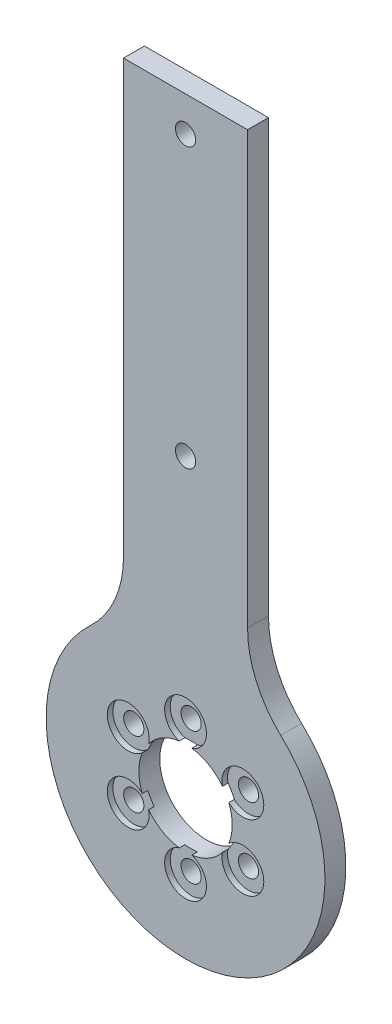
ISO-10303-21;
HEADER;
FILE_DESCRIPTION(('STEP AP214'),'2;1');
FILE_NAME('part.step','',(''),(''),'','','');
FILE_SCHEMA(('AUTOMOTIVE_DESIGN { 1 0 10303 214 1 1 1 1 }'));
ENDSEC;
DATA;
#1=APPLICATION_CONTEXT('core data for automotive mechanical design processes');
#2=APPLICATION_PROTOCOL_DEFINITION('international standard','automotive_design',2000,#1);
#3=PRODUCT_CONTEXT('',#1,'mechanical');
#4=PRODUCT('Part','Part','',(#3));
#5=PRODUCT_RELATED_PRODUCT_CATEGORY('part','',(#4));
#6=PRODUCT_DEFINITION_FORMATION('','',#4);
#7=PRODUCT_DEFINITION_CONTEXT('part definition',#1,'design');
#8=PRODUCT_DEFINITION('design','',#6,#7);
#9=PRODUCT_DEFINITION_SHAPE('','',#8);
#10=(LENGTH_UNIT() NAMED_UNIT(*) SI_UNIT(.MILLI.,.METRE.));
#11=(NAMED_UNIT(*) PLANE_ANGLE_UNIT() SI_UNIT($,.RADIAN.));
#12=(NAMED_UNIT(*) SI_UNIT($,.STERADIAN.) SOLID_ANGLE_UNIT());
#13=UNCERTAINTY_MEASURE_WITH_UNIT(LENGTH_MEASURE(1.E-05),#10,'distance_accuracy_value','');
#14=(GEOMETRIC_REPRESENTATION_CONTEXT(3) GLOBAL_UNCERTAINTY_ASSIGNED_CONTEXT((#13)) GLOBAL_UNIT_ASSIGNED_CONTEXT((#10,
#11,#12)) REPRESENTATION_CONTEXT('',''));
#15=CARTESIAN_POINT('',(0.,0.,0.));
#16=DIRECTION('',(0.,0.,1.));
#17=DIRECTION('',(1.,0.,0.));
#18=AXIS2_PLACEMENT_3D('',#15,#16,#17);
#19=CARTESIAN_POINT('',(0.,9.5,3.));
#20=DIRECTION('',(0.,0.,-1.));
#21=DIRECTION('',(-1.,0.,0.));
#22=AXIS2_PLACEMENT_3D('',#19,#20,#21);
#23=CYLINDRICAL_SURFACE('',#22,1.45);
#24=CARTESIAN_POINT('',(0.,9.5,0.));
#25=DIRECTION('',(0.,0.,1.));
#26=DIRECTION('',(1.,0.,0.));
#27=AXIS2_PLACEMENT_3D('',#24,#25,#26);
#28=CIRCLE('',#27,1.45);
#29=CARTESIAN_POINT('',(1.45,9.5,0.));
#30=VERTEX_POINT('',#29);
#31=EDGE_CURVE('E217',#30,#30,#28,.T.);
#32=ORIENTED_EDGE('',*,*,#31,.F.);
#33=EDGE_LOOP('',(#32));
#34=FACE_BOUND('',#33,.T.);
#35=CARTESIAN_POINT('',(0.,9.5,2.2));
#36=DIRECTION('',(0.,0.,1.));
#37=DIRECTION('',(1.,0.,0.));
#38=AXIS2_PLACEMENT_3D('',#35,#36,#37);
#39=CIRCLE('',#38,1.45);
#40=CARTESIAN_POINT('',(1.45,9.5,2.2));
#41=VERTEX_POINT('',#40);
#42=EDGE_CURVE('E282',#41,#41,#39,.T.);
#43=ORIENTED_EDGE('',*,*,#42,.T.);
#44=EDGE_LOOP('',(#43));
#45=FACE_BOUND('',#44,.T.);
#46=ADVANCED_FACE('F44',(#34,#45),#23,.F.);
#47=CARTESIAN_POINT('',(8.22724133595217,4.75,3.));
#48=DIRECTION('',(0.,0.,-1.));
#49=DIRECTION('',(-1.,0.,0.));
#50=AXIS2_PLACEMENT_3D('',#47,#48,#49);
#51=CYLINDRICAL_SURFACE('',#50,1.45);
#52=CARTESIAN_POINT('',(8.22724133595217,4.75,0.));
#53=DIRECTION('',(0.,0.,1.));
#54=DIRECTION('',(1.,0.,0.));
#55=AXIS2_PLACEMENT_3D('',#52,#53,#54);
#56=CIRCLE('',#55,1.45);
#57=CARTESIAN_POINT('',(9.67724133595217,4.75,0.));
#58=VERTEX_POINT('',#57);
#59=EDGE_CURVE('E388',#58,#58,#56,.T.);
#60=ORIENTED_EDGE('',*,*,#59,.F.);
#61=EDGE_LOOP('',(#60));
#62=FACE_BOUND('',#61,.T.);
#63=CARTESIAN_POINT('',(8.22724133595217,4.75,2.2));
#64=DIRECTION('',(0.,0.,1.));
#65=DIRECTION('',(1.,0.,0.));
#66=AXIS2_PLACEMENT_3D('',#63,#64,#65);
#67=CIRCLE('',#66,1.45);
#68=CARTESIAN_POINT('',(9.67724133595217,4.75,2.2));
#69=VERTEX_POINT('',#68);
#70=EDGE_CURVE('E277',#69,#69,#67,.T.);
#71=ORIENTED_EDGE('',*,*,#70,.T.);
#72=EDGE_LOOP('',(#71));
#73=FACE_BOUND('',#72,.T.);
#74=ADVANCED_FACE('F402',(#62,#73),#51,.F.);
#75=CARTESIAN_POINT('',(8.22724133595217,-4.75,3.));
#76=DIRECTION('',(0.,0.,-1.));
#77=DIRECTION('',(-1.,0.,0.));
#78=AXIS2_PLACEMENT_3D('',#75,#76,#77);
#79=CYLINDRICAL_SURFACE('',#78,1.45);
#80=CARTESIAN_POINT('',(8.22724133595217,-4.75,0.));
#81=DIRECTION('',(0.,0.,1.));
#82=DIRECTION('',(1.,0.,0.));
#83=AXIS2_PLACEMENT_3D('',#80,#81,#82);
#84=CIRCLE('',#83,1.45);
#85=CARTESIAN_POINT('',(9.67724133595217,-4.75,0.));
#86=VERTEX_POINT('',#85);
#87=EDGE_CURVE('E385',#86,#86,#84,.T.);
#88=ORIENTED_EDGE('',*,*,#87,.F.);
#89=EDGE_LOOP('',(#88));
#90=FACE_BOUND('',#89,.T.);
#91=CARTESIAN_POINT('',(8.22724133595217,-4.75,2.2));
#92=DIRECTION('',(0.,0.,1.));
#93=DIRECTION('',(1.,0.,0.));
#94=AXIS2_PLACEMENT_3D('',#91,#92,#93);
#95=CIRCLE('',#94,1.45);
#96=CARTESIAN_POINT('',(9.67724133595217,-4.75,2.2));
#97=VERTEX_POINT('',#96);
#98=EDGE_CURVE('E272',#97,#97,#95,.T.);
#99=ORIENTED_EDGE('',*,*,#98,.T.);
#100=EDGE_LOOP('',(#99));
#101=FACE_BOUND('',#100,.T.);
#102=ADVANCED_FACE('F541',(#90,#101),#79,.F.);
#103=CARTESIAN_POINT('',(0.,-9.5,3.));
#104=DIRECTION('',(0.,0.,-1.));
#105=DIRECTION('',(-1.,0.,0.));
#106=AXIS2_PLACEMENT_3D('',#103,#104,#105);
#107=CYLINDRICAL_SURFACE('',#106,1.45);
#108=CARTESIAN_POINT('',(0.,-9.5,0.));
#109=DIRECTION('',(0.,0.,1.));
#110=DIRECTION('',(1.,0.,0.));
#111=AXIS2_PLACEMENT_3D('',#108,#109,#110);
#112=CIRCLE('',#111,1.45);
#113=CARTESIAN_POINT('',(1.45,-9.5,0.));
#114=VERTEX_POINT('',#113);
#115=EDGE_CURVE('E381',#114,#114,#112,.T.);
#116=ORIENTED_EDGE('',*,*,#115,.F.);
#117=EDGE_LOOP('',(#116));
#118=FACE_BOUND('',#117,.T.);
#119=CARTESIAN_POINT('',(0.,-9.5,2.2));
#120=DIRECTION('',(0.,0.,1.));
#121=DIRECTION('',(1.,0.,0.));
#122=AXIS2_PLACEMENT_3D('',#119,#120,#121);
#123=CIRCLE('',#122,1.45);
#124=CARTESIAN_POINT('',(1.45,-9.5,2.2));
#125=VERTEX_POINT('',#124);
#126=EDGE_CURVE('E267',#125,#125,#123,.T.);
#127=ORIENTED_EDGE('',*,*,#126,.T.);
#128=EDGE_LOOP('',(#127));
#129=FACE_BOUND('',#128,.T.);
#130=ADVANCED_FACE('F537',(#118,#129),#107,.F.);
#131=CARTESIAN_POINT('',(-8.22724133595217,-4.75,3.));
#132=DIRECTION('',(0.,0.,-1.));
#133=DIRECTION('',(-1.,0.,0.));
#134=AXIS2_PLACEMENT_3D('',#131,#132,#133);
#135=CYLINDRICAL_SURFACE('',#134,1.45);
#136=CARTESIAN_POINT('',(-8.22724133595217,-4.75,0.));
#137=DIRECTION('',(0.,0.,1.));
#138=DIRECTION('',(1.,0.,0.));
#139=AXIS2_PLACEMENT_3D('',#136,#137,#138);
#140=CIRCLE('',#139,1.45);
#141=CARTESIAN_POINT('',(-6.77724133595216,-4.75,0.));
#142=VERTEX_POINT('',#141);
#143=EDGE_CURVE('E377',#142,#142,#140,.T.);
#144=ORIENTED_EDGE('',*,*,#143,.F.);
#145=EDGE_LOOP('',(#144));
#146=FACE_BOUND('',#145,.T.);
#147=CARTESIAN_POINT('',(-8.22724133595217,-4.75,2.2));
#148=DIRECTION('',(0.,0.,1.));
#149=DIRECTION('',(1.,0.,0.));
#150=AXIS2_PLACEMENT_3D('',#147,#148,#149);
#151=CIRCLE('',#150,1.45);
#152=CARTESIAN_POINT('',(-6.77724133595216,-4.75,2.2));
#153=VERTEX_POINT('',#152);
#154=EDGE_CURVE('E262',#153,#153,#151,.T.);
#155=ORIENTED_EDGE('',*,*,#154,.T.);
#156=EDGE_LOOP('',(#155));
#157=FACE_BOUND('',#156,.T.);
#158=ADVANCED_FACE('F533',(#146,#157),#135,.F.);
#159=CARTESIAN_POINT('',(-8.22724133595217,4.75,3.));
#160=DIRECTION('',(0.,0.,-1.));
#161=DIRECTION('',(-1.,0.,0.));
#162=AXIS2_PLACEMENT_3D('',#159,#160,#161);
#163=CYLINDRICAL_SURFACE('',#162,1.45);
#164=CARTESIAN_POINT('',(-8.22724133595217,4.75,0.));
#165=DIRECTION('',(0.,0.,1.));
#166=DIRECTION('',(1.,0.,0.));
#167=AXIS2_PLACEMENT_3D('',#164,#165,#166);
#168=CIRCLE('',#167,1.45);
#169=CARTESIAN_POINT('',(-6.77724133595217,4.75,0.));
#170=VERTEX_POINT('',#169);
#171=EDGE_CURVE('E373',#170,#170,#168,.T.);
#172=ORIENTED_EDGE('',*,*,#171,.F.);
#173=EDGE_LOOP('',(#172));
#174=FACE_BOUND('',#173,.T.);
#175=CARTESIAN_POINT('',(-8.22724133595217,4.75,2.2));
#176=DIRECTION('',(0.,0.,1.));
#177=DIRECTION('',(1.,0.,0.));
#178=AXIS2_PLACEMENT_3D('',#175,#176,#177);
#179=CIRCLE('',#178,1.45);
#180=CARTESIAN_POINT('',(-6.77724133595217,4.75,2.2));
#181=VERTEX_POINT('',#180);
#182=EDGE_CURVE('E257',#181,#181,#179,.T.);
#183=ORIENTED_EDGE('',*,*,#182,.T.);
#184=EDGE_LOOP('',(#183));
#185=FACE_BOUND('',#184,.T.);
#186=ADVANCED_FACE('F529',(#174,#185),#163,.F.);
#187=CARTESIAN_POINT('',(0.,0.,3.));
#188=DIRECTION('',(0.,0.,-1.));
#189=DIRECTION('',(-1.,0.,0.));
#190=AXIS2_PLACEMENT_3D('',#187,#188,#189);
#191=CYLINDRICAL_SURFACE('',#190,20.);
#192=CARTESIAN_POINT('',(0.,0.,3.));
#193=DIRECTION('',(0.,0.,1.));
#194=DIRECTION('',(1.,0.,0.));
#195=AXIS2_PLACEMENT_3D('',#192,#193,#194);
#196=CIRCLE('',#195,20.);
#197=CARTESIAN_POINT('',(-13.6571428571429,14.6110386003046,3.));
#198=VERTEX_POINT('',#197);
#199=CARTESIAN_POINT('',(13.6571428571429,14.6110386003046,3.));
#200=VERTEX_POINT('',#199);
#201=EDGE_CURVE('E222',#198,#200,#196,.T.);
#202=ORIENTED_EDGE('',*,*,#201,.F.);
#203=DIRECTION('',(0.,0.,-1.));
#204=VECTOR('',#203,1.);
#205=CARTESIAN_POINT('',(-13.6571428571429,14.6110386003046,3.));
#206=LINE('',#205,#204);
#207=CARTESIAN_POINT('',(-13.6571428571429,14.6110386003046,0.));
#208=VERTEX_POINT('',#207);
#209=EDGE_CURVE('E237',#198,#208,#206,.T.);
#210=ORIENTED_EDGE('',*,*,#209,.T.);
#211=CARTESIAN_POINT('',(0.,0.,0.));
#212=DIRECTION('',(0.,0.,1.));
#213=DIRECTION('',(1.,0.,0.));
#214=AXIS2_PLACEMENT_3D('',#211,#212,#213);
#215=CIRCLE('',#214,20.);
#216=CARTESIAN_POINT('',(13.6571428571429,14.6110386003046,0.));
#217=VERTEX_POINT('',#216);
#218=EDGE_CURVE('E227',#208,#217,#215,.T.);
#219=ORIENTED_EDGE('',*,*,#218,.T.);
#220=DIRECTION('',(0.,0.,-1.));
#221=VECTOR('',#220,1.);
#222=CARTESIAN_POINT('',(13.6571428571429,14.6110386003046,3.));
#223=LINE('',#222,#221);
#224=EDGE_CURVE('E234',#217,#200,#223,.F.);
#225=ORIENTED_EDGE('',*,*,#224,.T.);
#226=EDGE_LOOP('',(#202,#210,#219,#225));
#227=FACE_BOUND('',#226,.T.);
#228=ADVANCED_FACE('F532',(#227),#191,.T.);
#229=CARTESIAN_POINT('',(0.,0.,3.));
#230=DIRECTION('',(0.,0.,1.));
#231=DIRECTION('',(1.,0.,0.));
#232=AXIS2_PLACEMENT_3D('',#229,#230,#231);
#233=PLANE('',#232);
#234=CARTESIAN_POINT('',(8.22724133595217,4.75,3.));
#235=DIRECTION('',(0.,0.,1.));
#236=DIRECTION('',(1.,0.,0.));
#237=AXIS2_PLACEMENT_3D('',#234,#235,#236);
#238=CIRCLE('',#237,3.);
#239=CARTESIAN_POINT('',(6.20071150321712,2.53794737019327,3.));
#240=VERTEX_POINT('',#239);
#241=CARTESIAN_POINT('',(5.29828264766384,4.10099999822778,3.));
#242=VERTEX_POINT('',#241);
#243=EDGE_CURVE('E318',#240,#242,#238,.T.);
#244=ORIENTED_EDGE('',*,*,#243,.F.);
#245=CARTESIAN_POINT('',(0.,0.,3.));
#246=DIRECTION('',(0.,0.,1.));
#247=DIRECTION('',(1.,0.,0.));
#248=AXIS2_PLACEMENT_3D('',#245,#246,#247);
#249=CIRCLE('',#248,6.7);
#250=CARTESIAN_POINT('',(6.20071150321712,-2.53794737019327,3.));
#251=VERTEX_POINT('',#250);
#252=EDGE_CURVE('E211',#251,#240,#249,.T.);
#253=ORIENTED_EDGE('',*,*,#252,.F.);
#254=CARTESIAN_POINT('',(8.22724133595217,-4.75,3.));
#255=DIRECTION('',(0.,0.,1.));
#256=DIRECTION('',(1.,0.,0.));
#257=AXIS2_PLACEMENT_3D('',#254,#255,#256);
#258=CIRCLE('',#257,3.);
#259=CARTESIAN_POINT('',(5.29828264766384,-4.10099999822778,3.));
#260=VERTEX_POINT('',#259);
#261=EDGE_CURVE('E459',#260,#251,#258,.T.);
#262=ORIENTED_EDGE('',*,*,#261,.F.);
#263=CARTESIAN_POINT('',(0.90242885555327,-6.63894736842105,3.));
#264=VERTEX_POINT('',#263);
#265=EDGE_CURVE('E210',#264,#260,#249,.T.);
#266=ORIENTED_EDGE('',*,*,#265,.F.);
#267=CARTESIAN_POINT('',(0.,-9.5,3.));
#268=DIRECTION('',(0.,0.,1.));
#269=DIRECTION('',(1.,0.,0.));
#270=AXIS2_PLACEMENT_3D('',#267,#268,#269);
#271=CIRCLE('',#270,3.);
#272=CARTESIAN_POINT('',(-0.902428855553268,-6.63894736842105,3.));
#273=VERTEX_POINT('',#272);
#274=EDGE_CURVE('E443',#273,#264,#271,.T.);
#275=ORIENTED_EDGE('',*,*,#274,.F.);
#276=CARTESIAN_POINT('',(-5.29828264766384,-4.10099999822778,3.));
#277=VERTEX_POINT('',#276);
#278=EDGE_CURVE('E204',#277,#273,#249,.T.);
#279=ORIENTED_EDGE('',*,*,#278,.F.);
#280=CARTESIAN_POINT('',(-8.22724133595217,-4.75,3.));
#281=DIRECTION('',(0.,0.,1.));
#282=DIRECTION('',(1.,0.,0.));
#283=AXIS2_PLACEMENT_3D('',#280,#281,#282);
#284=CIRCLE('',#283,3.);
#285=CARTESIAN_POINT('',(-6.20071150321711,-2.53794737019328,3.));
#286=VERTEX_POINT('',#285);
#287=EDGE_CURVE('E201',#286,#277,#284,.T.);
#288=ORIENTED_EDGE('',*,*,#287,.F.);
#289=CARTESIAN_POINT('',(-6.20071150321711,2.53794737019328,3.));
#290=VERTEX_POINT('',#289);
#291=EDGE_CURVE('E191',#290,#286,#249,.T.);
#292=ORIENTED_EDGE('',*,*,#291,.F.);
#293=CARTESIAN_POINT('',(-8.22724133595217,4.75,3.));
#294=DIRECTION('',(0.,0.,1.));
#295=DIRECTION('',(1.,0.,0.));
#296=AXIS2_PLACEMENT_3D('',#293,#294,#295);
#297=CIRCLE('',#296,3.);
#298=CARTESIAN_POINT('',(-5.29828264766384,4.10099999822778,3.));
#299=VERTEX_POINT('',#298);
#300=EDGE_CURVE('E169',#299,#290,#297,.T.);
#301=ORIENTED_EDGE('',*,*,#300,.F.);
#302=CARTESIAN_POINT('',(-0.902428855553269,6.63894736842105,3.));
#303=VERTEX_POINT('',#302);
#304=EDGE_CURVE('E203',#303,#299,#249,.T.);
#305=ORIENTED_EDGE('',*,*,#304,.F.);
#306=CARTESIAN_POINT('',(0.,9.5,3.));
#307=DIRECTION('',(0.,0.,1.));
#308=DIRECTION('',(1.,0.,0.));
#309=AXIS2_PLACEMENT_3D('',#306,#307,#308);
#310=CIRCLE('',#309,3.);
#311=CARTESIAN_POINT('',(0.902428855553269,6.63894736842105,3.));
#312=VERTEX_POINT('',#311);
#313=EDGE_CURVE('E415',#312,#303,#310,.T.);
#314=ORIENTED_EDGE('',*,*,#313,.F.);
#315=EDGE_CURVE('E208',#242,#312,#249,.T.);
#316=ORIENTED_EDGE('',*,*,#315,.F.);
#317=EDGE_LOOP('',(#244,#253,#262,#266,#275,#279,#288,#292,#301,#305,#314,#316));
#318=FACE_BOUND('',#317,.T.);
#319=DIRECTION('',(0.,-1.,0.));
#320=VECTOR('',#319,1.);
#321=CARTESIAN_POINT('',(-8.9,12.5,3.));
#322=LINE('',#321,#320);
#323=CARTESIAN_POINT('',(-8.9,87.5,3.));
#324=VERTEX_POINT('',#323);
#325=CARTESIAN_POINT('',(-8.9,25.5693175505331,3.));
#326=VERTEX_POINT('',#325);
#327=EDGE_CURVE('E353',#324,#326,#322,.T.);
#328=ORIENTED_EDGE('',*,*,#327,.T.);
#329=CARTESIAN_POINT('',(-23.9,25.5693175505331,3.));
#330=DIRECTION('',(0.,0.,1.));
#331=DIRECTION('',(1.,0.,0.));
#332=AXIS2_PLACEMENT_3D('',#329,#330,#331);
#333=CIRCLE('',#332,15.);
#334=EDGE_CURVE('E244',#326,#198,#333,.F.);
#335=ORIENTED_EDGE('',*,*,#334,.T.);
#336=ORIENTED_EDGE('',*,*,#201,.T.);
#337=CARTESIAN_POINT('',(23.9,25.5693175505331,3.));
#338=DIRECTION('',(0.,0.,1.));
#339=DIRECTION('',(1.,0.,0.));
#340=AXIS2_PLACEMENT_3D('',#337,#338,#339);
#341=CIRCLE('',#340,15.);
#342=CARTESIAN_POINT('',(8.9,25.5693175505331,3.));
#343=VERTEX_POINT('',#342);
#344=EDGE_CURVE('E253',#200,#343,#341,.F.);
#345=ORIENTED_EDGE('',*,*,#344,.T.);
#346=DIRECTION('',(0.,1.,0.));
#347=VECTOR('',#346,1.);
#348=CARTESIAN_POINT('',(8.9,12.5,3.));
#349=LINE('',#348,#347);
#350=CARTESIAN_POINT('',(8.9,87.5,3.));
#351=VERTEX_POINT('',#350);
#352=EDGE_CURVE('E346',#343,#351,#349,.T.);
#353=ORIENTED_EDGE('',*,*,#352,.T.);
#354=DIRECTION('',(-1.,0.,0.));
#355=VECTOR('',#354,1.);
#356=CARTESIAN_POINT('',(-8.9,87.5,3.));
#357=LINE('',#356,#355);
#358=EDGE_CURVE('E349',#351,#324,#357,.T.);
#359=ORIENTED_EDGE('',*,*,#358,.T.);
#360=EDGE_LOOP('',(#328,#335,#336,#345,#353,#359));
#361=FACE_BOUND('',#360,.T.);
#362=CARTESIAN_POINT('',(0.,42.5,3.));
#363=DIRECTION('',(0.,0.,1.));
#364=DIRECTION('',(1.,0.,0.));
#365=AXIS2_PLACEMENT_3D('',#362,#363,#364);
#366=CIRCLE('',#365,1.45);
#367=CARTESIAN_POINT('',(1.45,42.5,3.));
#368=VERTEX_POINT('',#367);
#369=EDGE_CURVE('E338',#368,#368,#366,.T.);
#370=ORIENTED_EDGE('',*,*,#369,.F.);
#371=EDGE_LOOP('',(#370));
#372=FACE_BOUND('',#371,.T.);
#373=CARTESIAN_POINT('',(0.,82.5,3.));
#374=DIRECTION('',(0.,0.,1.));
#375=DIRECTION('',(1.,0.,0.));
#376=AXIS2_PLACEMENT_3D('',#373,#374,#375);
#377=CIRCLE('',#376,1.45);
#378=CARTESIAN_POINT('',(1.45,82.5,3.));
#379=VERTEX_POINT('',#378);
#380=EDGE_CURVE('E330',#379,#379,#377,.T.);
#381=ORIENTED_EDGE('',*,*,#380,.F.);
#382=EDGE_LOOP('',(#381));
#383=FACE_BOUND('',#382,.T.);
#384=ADVANCED_FACE('F198',(#318,#361,#372,#383),#233,.T.);
#385=CARTESIAN_POINT('',(0.,0.,0.));
#386=DIRECTION('',(0.,0.,1.));
#387=DIRECTION('',(1.,0.,0.));
#388=AXIS2_PLACEMENT_3D('',#385,#386,#387);
#389=PLANE('',#388);
#390=ORIENTED_EDGE('',*,*,#218,.F.);
#391=CARTESIAN_POINT('',(-23.9,25.5693175505331,0.));
#392=DIRECTION('',(0.,0.,1.));
#393=DIRECTION('',(1.,0.,0.));
#394=AXIS2_PLACEMENT_3D('',#391,#392,#393);
#395=CIRCLE('',#394,15.);
#396=CARTESIAN_POINT('',(-8.9,25.5693175505331,0.));
#397=VERTEX_POINT('',#396);
#398=EDGE_CURVE('E247',#208,#397,#395,.T.);
#399=ORIENTED_EDGE('',*,*,#398,.T.);
#400=DIRECTION('',(0.,-1.,0.));
#401=VECTOR('',#400,1.);
#402=CARTESIAN_POINT('',(-8.9,12.5,0.));
#403=LINE('',#402,#401);
#404=CARTESIAN_POINT('',(-8.9,87.5,0.));
#405=VERTEX_POINT('',#404);
#406=EDGE_CURVE('E350',#405,#397,#403,.T.);
#407=ORIENTED_EDGE('',*,*,#406,.F.);
#408=DIRECTION('',(-1.,0.,0.));
#409=VECTOR('',#408,1.);
#410=CARTESIAN_POINT('',(-8.9,87.5,0.));
#411=LINE('',#410,#409);
#412=CARTESIAN_POINT('',(8.9,87.5,0.));
#413=VERTEX_POINT('',#412);
#414=EDGE_CURVE('E360',#413,#405,#411,.T.);
#415=ORIENTED_EDGE('',*,*,#414,.F.);
#416=DIRECTION('',(0.,1.,0.));
#417=VECTOR('',#416,1.);
#418=CARTESIAN_POINT('',(8.9,12.5,0.));
#419=LINE('',#418,#417);
#420=CARTESIAN_POINT('',(8.9,25.5693175505331,0.));
#421=VERTEX_POINT('',#420);
#422=EDGE_CURVE('E342',#421,#413,#419,.T.);
#423=ORIENTED_EDGE('',*,*,#422,.F.);
#424=CARTESIAN_POINT('',(23.9,25.5693175505331,0.));
#425=DIRECTION('',(0.,0.,1.));
#426=DIRECTION('',(1.,0.,0.));
#427=AXIS2_PLACEMENT_3D('',#424,#425,#426);
#428=CIRCLE('',#427,15.);
#429=EDGE_CURVE('E250',#421,#217,#428,.T.);
#430=ORIENTED_EDGE('',*,*,#429,.T.);
#431=EDGE_LOOP('',(#390,#399,#407,#415,#423,#430));
#432=FACE_BOUND('',#431,.T.);
#433=CARTESIAN_POINT('',(0.,42.5,0.));
#434=DIRECTION('',(0.,0.,1.));
#435=DIRECTION('',(1.,0.,0.));
#436=AXIS2_PLACEMENT_3D('',#433,#434,#435);
#437=CIRCLE('',#436,1.45);
#438=CARTESIAN_POINT('',(1.45,42.5,0.));
#439=VERTEX_POINT('',#438);
#440=EDGE_CURVE('E334',#439,#439,#437,.T.);
#441=ORIENTED_EDGE('',*,*,#440,.T.);
#442=EDGE_LOOP('',(#441));
#443=FACE_BOUND('',#442,.T.);
#444=CARTESIAN_POINT('',(0.,82.5,0.));
#445=DIRECTION('',(0.,0.,1.));
#446=DIRECTION('',(1.,0.,0.));
#447=AXIS2_PLACEMENT_3D('',#444,#445,#446);
#448=CIRCLE('',#447,1.45);
#449=CARTESIAN_POINT('',(1.45,82.5,0.));
#450=VERTEX_POINT('',#449);
#451=EDGE_CURVE('E329',#450,#450,#448,.T.);
#452=ORIENTED_EDGE('',*,*,#451,.T.);
#453=EDGE_LOOP('',(#452));
#454=FACE_BOUND('',#453,.T.);
#455=ORIENTED_EDGE('',*,*,#171,.T.);
#456=EDGE_LOOP('',(#455));
#457=FACE_BOUND('',#456,.T.);
#458=ORIENTED_EDGE('',*,*,#143,.T.);
#459=EDGE_LOOP('',(#458));
#460=FACE_BOUND('',#459,.T.);
#461=ORIENTED_EDGE('',*,*,#115,.T.);
#462=EDGE_LOOP('',(#461));
#463=FACE_BOUND('',#462,.T.);
#464=ORIENTED_EDGE('',*,*,#87,.T.);
#465=EDGE_LOOP('',(#464));
#466=FACE_BOUND('',#465,.T.);
#467=ORIENTED_EDGE('',*,*,#59,.T.);
#468=EDGE_LOOP('',(#467));
#469=FACE_BOUND('',#468,.T.);
#470=ORIENTED_EDGE('',*,*,#31,.T.);
#471=EDGE_LOOP('',(#470));
#472=FACE_BOUND('',#471,.T.);
#473=CARTESIAN_POINT('',(0.,0.,0.));
#474=DIRECTION('',(0.,0.,1.));
#475=DIRECTION('',(1.,0.,0.));
#476=AXIS2_PLACEMENT_3D('',#473,#474,#475);
#477=CIRCLE('',#476,6.7);
#478=CARTESIAN_POINT('',(6.7,0.,0.));
#479=VERTEX_POINT('',#478);
#480=EDGE_CURVE('E216',#479,#479,#477,.T.);
#481=ORIENTED_EDGE('',*,*,#480,.T.);
#482=EDGE_LOOP('',(#481));
#483=FACE_BOUND('',#482,.T.);
#484=ADVANCED_FACE('F397',(#432,#443,#454,#457,#460,#463,#466,#469,#472,#483),#389,.F.);
#485=CARTESIAN_POINT('',(0.,0.,3.));
#486=DIRECTION('',(0.,0.,-1.));
#487=DIRECTION('',(-1.,0.,0.));
#488=AXIS2_PLACEMENT_3D('',#485,#486,#487);
#489=CYLINDRICAL_SURFACE('',#488,6.7);
#490=DIRECTION('',(0.,0.,1.));
#491=VECTOR('',#490,1.);
#492=CARTESIAN_POINT('',(6.20071150321712,2.53794737019327,2.6));
#493=LINE('',#492,#491);
#494=CARTESIAN_POINT('',(6.20071150321712,2.53794737019327,2.2));
#495=VERTEX_POINT('',#494);
#496=EDGE_CURVE('E11',#495,#240,#493,.T.);
#497=ORIENTED_EDGE('',*,*,#496,.F.);
#498=CARTESIAN_POINT('',(0.,0.,2.2));
#499=DIRECTION('',(0.,0.,1.));
#500=DIRECTION('',(1.,0.,0.));
#501=AXIS2_PLACEMENT_3D('',#498,#499,#500);
#502=CIRCLE('',#501,6.7);
#503=CARTESIAN_POINT('',(5.29828264766384,4.10099999822778,2.2));
#504=VERTEX_POINT('',#503);
#505=EDGE_CURVE('E281',#495,#504,#502,.T.);
#506=ORIENTED_EDGE('',*,*,#505,.T.);
#507=DIRECTION('',(0.,0.,1.));
#508=VECTOR('',#507,1.);
#509=CARTESIAN_POINT('',(5.29828264766384,4.10099999822778,2.6));
#510=LINE('',#509,#508);
#511=EDGE_CURVE('E53',#242,#504,#510,.F.);
#512=ORIENTED_EDGE('',*,*,#511,.F.);
#513=ORIENTED_EDGE('',*,*,#315,.T.);
#514=DIRECTION('',(0.,0.,1.));
#515=VECTOR('',#514,1.);
#516=CARTESIAN_POINT('',(0.902428855553271,6.63894736842105,2.6));
#517=LINE('',#516,#515);
#518=CARTESIAN_POINT('',(0.902428855553269,6.63894736842105,2.2));
#519=VERTEX_POINT('',#518);
#520=EDGE_CURVE('E194',#519,#312,#517,.T.);
#521=ORIENTED_EDGE('',*,*,#520,.F.);
#522=CARTESIAN_POINT('',(0.,0.,2.2));
#523=DIRECTION('',(0.,0.,1.));
#524=DIRECTION('',(1.,0.,0.));
#525=AXIS2_PLACEMENT_3D('',#522,#523,#524);
#526=CIRCLE('',#525,6.7);
#527=CARTESIAN_POINT('',(-0.902428855553269,6.63894736842105,2.2));
#528=VERTEX_POINT('',#527);
#529=EDGE_CURVE('E286',#519,#528,#526,.T.);
#530=ORIENTED_EDGE('',*,*,#529,.T.);
#531=DIRECTION('',(0.,0.,1.));
#532=VECTOR('',#531,1.);
#533=CARTESIAN_POINT('',(-0.902428855553271,6.63894736842105,2.6));
#534=LINE('',#533,#532);
#535=EDGE_CURVE('E256',#303,#528,#534,.F.);
#536=ORIENTED_EDGE('',*,*,#535,.F.);
#537=ORIENTED_EDGE('',*,*,#304,.T.);
#538=DIRECTION('',(0.,0.,1.));
#539=VECTOR('',#538,1.);
#540=CARTESIAN_POINT('',(-5.29828264766384,4.10099999822777,2.6));
#541=LINE('',#540,#539);
#542=CARTESIAN_POINT('',(-5.29828264766384,4.10099999822778,2.2));
#543=VERTEX_POINT('',#542);
#544=EDGE_CURVE('E176',#543,#299,#541,.T.);
#545=ORIENTED_EDGE('',*,*,#544,.F.);
#546=CARTESIAN_POINT('',(0.,0.,2.2));
#547=DIRECTION('',(0.,0.,1.));
#548=DIRECTION('',(1.,0.,0.));
#549=AXIS2_PLACEMENT_3D('',#546,#547,#548);
#550=CIRCLE('',#549,6.7);
#551=CARTESIAN_POINT('',(-6.20071150321711,2.53794737019328,2.2));
#552=VERTEX_POINT('',#551);
#553=EDGE_CURVE('E192',#543,#552,#550,.T.);
#554=ORIENTED_EDGE('',*,*,#553,.T.);
#555=DIRECTION('',(0.,0.,1.));
#556=VECTOR('',#555,1.);
#557=CARTESIAN_POINT('',(-6.20071150321711,2.53794737019328,2.6));
#558=LINE('',#557,#556);
#559=EDGE_CURVE('E173',#290,#552,#558,.F.);
#560=ORIENTED_EDGE('',*,*,#559,.F.);
#561=ORIENTED_EDGE('',*,*,#291,.T.);
#562=DIRECTION('',(0.,0.,1.));
#563=VECTOR('',#562,1.);
#564=CARTESIAN_POINT('',(-6.20071150321711,-2.53794737019328,2.6));
#565=LINE('',#564,#563);
#566=CARTESIAN_POINT('',(-6.20071150321711,-2.53794737019328,2.2));
#567=VERTEX_POINT('',#566);
#568=EDGE_CURVE('E298',#567,#286,#565,.T.);
#569=ORIENTED_EDGE('',*,*,#568,.F.);
#570=CARTESIAN_POINT('',(0.,0.,2.2));
#571=DIRECTION('',(0.,0.,1.));
#572=DIRECTION('',(1.,0.,0.));
#573=AXIS2_PLACEMENT_3D('',#570,#571,#572);
#574=CIRCLE('',#573,6.7);
#575=CARTESIAN_POINT('',(-5.29828264766384,-4.10099999822778,2.2));
#576=VERTEX_POINT('',#575);
#577=EDGE_CURVE('E266',#567,#576,#574,.T.);
#578=ORIENTED_EDGE('',*,*,#577,.T.);
#579=DIRECTION('',(0.,0.,1.));
#580=VECTOR('',#579,1.);
#581=CARTESIAN_POINT('',(-5.29828264766384,-4.10099999822778,2.6));
#582=LINE('',#581,#580);
#583=EDGE_CURVE('E294',#277,#576,#582,.F.);
#584=ORIENTED_EDGE('',*,*,#583,.F.);
#585=ORIENTED_EDGE('',*,*,#278,.T.);
#586=DIRECTION('',(0.,0.,1.));
#587=VECTOR('',#586,1.);
#588=CARTESIAN_POINT('',(-0.902428855553267,-6.63894736842105,2.6));
#589=LINE('',#588,#587);
#590=CARTESIAN_POINT('',(-0.902428855553268,-6.63894736842105,2.2));
#591=VERTEX_POINT('',#590);
#592=EDGE_CURVE('E305',#591,#273,#589,.T.);
#593=ORIENTED_EDGE('',*,*,#592,.F.);
#594=CARTESIAN_POINT('',(0.,0.,2.2));
#595=DIRECTION('',(0.,0.,1.));
#596=DIRECTION('',(1.,0.,0.));
#597=AXIS2_PLACEMENT_3D('',#594,#595,#596);
#598=CIRCLE('',#597,6.7);
#599=CARTESIAN_POINT('',(0.90242885555327,-6.63894736842105,2.2));
#600=VERTEX_POINT('',#599);
#601=EDGE_CURVE('E271',#591,#600,#598,.T.);
#602=ORIENTED_EDGE('',*,*,#601,.T.);
#603=DIRECTION('',(0.,0.,1.));
#604=VECTOR('',#603,1.);
#605=CARTESIAN_POINT('',(0.902428855553269,-6.63894736842105,2.6));
#606=LINE('',#605,#604);
#607=EDGE_CURVE('E301',#264,#600,#606,.F.);
#608=ORIENTED_EDGE('',*,*,#607,.F.);
#609=ORIENTED_EDGE('',*,*,#265,.T.);
#610=DIRECTION('',(0.,0.,1.));
#611=VECTOR('',#610,1.);
#612=CARTESIAN_POINT('',(5.29828264766384,-4.10099999822778,2.6));
#613=LINE('',#612,#611);
#614=CARTESIAN_POINT('',(5.29828264766384,-4.10099999822778,2.2));
#615=VERTEX_POINT('',#614);
#616=EDGE_CURVE('E311',#615,#260,#613,.T.);
#617=ORIENTED_EDGE('',*,*,#616,.F.);
#618=CARTESIAN_POINT('',(0.,0.,2.2));
#619=DIRECTION('',(0.,0.,1.));
#620=DIRECTION('',(1.,0.,0.));
#621=AXIS2_PLACEMENT_3D('',#618,#619,#620);
#622=CIRCLE('',#621,6.7);
#623=CARTESIAN_POINT('',(6.20071150321712,-2.53794737019327,2.2));
#624=VERTEX_POINT('',#623);
#625=EDGE_CURVE('E276',#615,#624,#622,.T.);
#626=ORIENTED_EDGE('',*,*,#625,.T.);
#627=DIRECTION('',(0.,0.,1.));
#628=VECTOR('',#627,1.);
#629=CARTESIAN_POINT('',(6.20071150321712,-2.53794737019327,2.6));
#630=LINE('',#629,#628);
#631=EDGE_CURVE('E308',#251,#624,#630,.F.);
#632=ORIENTED_EDGE('',*,*,#631,.F.);
#633=ORIENTED_EDGE('',*,*,#252,.T.);
#634=EDGE_LOOP('',(#497,#506,#512,#513,#521,#530,#536,#537,#545,#554,#560,#561,#569,#578,#584,
#585,#593,#602,#608,#609,#617,#626,#632,#633));
#635=FACE_BOUND('',#634,.T.);
#636=ORIENTED_EDGE('',*,*,#480,.F.);
#637=EDGE_LOOP('',(#636));
#638=FACE_BOUND('',#637,.T.);
#639=ADVANCED_FACE('F188',(#635,#638),#489,.F.);
#640=CARTESIAN_POINT('',(8.9,12.5,3.));
#641=DIRECTION('',(-1.,0.,0.));
#642=DIRECTION('',(0.,0.,1.));
#643=AXIS2_PLACEMENT_3D('',#640,#641,#642);
#644=PLANE('',#643);
#645=ORIENTED_EDGE('',*,*,#352,.F.);
#646=DIRECTION('',(0.,0.,1.));
#647=VECTOR('',#646,1.);
#648=CARTESIAN_POINT('',(8.9,25.5693175505331,0.));
#649=LINE('',#648,#647);
#650=EDGE_CURVE('E240',#343,#421,#649,.F.);
#651=ORIENTED_EDGE('',*,*,#650,.T.);
#652=ORIENTED_EDGE('',*,*,#422,.T.);
#653=DIRECTION('',(0.,0.,-1.));
#654=VECTOR('',#653,1.);
#655=CARTESIAN_POINT('',(8.9,87.5,3.));
#656=LINE('',#655,#654);
#657=EDGE_CURVE('E369',#351,#413,#656,.T.);
#658=ORIENTED_EDGE('',*,*,#657,.F.);
#659=EDGE_LOOP('',(#645,#651,#652,#658));
#660=FACE_BOUND('',#659,.T.);
#661=ADVANCED_FACE('F521',(#660),#644,.F.);
#662=CARTESIAN_POINT('',(-8.9,12.5,3.));
#663=DIRECTION('',(1.,0.,0.));
#664=DIRECTION('',(0.,0.,-1.));
#665=AXIS2_PLACEMENT_3D('',#662,#663,#664);
#666=PLANE('',#665);
#667=ORIENTED_EDGE('',*,*,#406,.T.);
#668=DIRECTION('',(0.,0.,1.));
#669=VECTOR('',#668,1.);
#670=CARTESIAN_POINT('',(-8.9,25.5693175505331,3.));
#671=LINE('',#670,#669);
#672=EDGE_CURVE('E226',#397,#326,#671,.T.);
#673=ORIENTED_EDGE('',*,*,#672,.T.);
#674=ORIENTED_EDGE('',*,*,#327,.F.);
#675=DIRECTION('',(0.,0.,-1.));
#676=VECTOR('',#675,1.);
#677=CARTESIAN_POINT('',(-8.9,87.5,3.));
#678=LINE('',#677,#676);
#679=EDGE_CURVE('E357',#324,#405,#678,.T.);
#680=ORIENTED_EDGE('',*,*,#679,.T.);
#681=EDGE_LOOP('',(#667,#673,#674,#680));
#682=FACE_BOUND('',#681,.T.);
#683=ADVANCED_FACE('F518',(#682),#666,.F.);
#684=CARTESIAN_POINT('',(-8.9,87.5,3.));
#685=DIRECTION('',(0.,-1.,0.));
#686=DIRECTION('',(0.,0.,-1.));
#687=AXIS2_PLACEMENT_3D('',#684,#685,#686);
#688=PLANE('',#687);
#689=ORIENTED_EDGE('',*,*,#414,.T.);
#690=ORIENTED_EDGE('',*,*,#679,.F.);
#691=ORIENTED_EDGE('',*,*,#358,.F.);
#692=ORIENTED_EDGE('',*,*,#657,.T.);
#693=EDGE_LOOP('',(#689,#690,#691,#692));
#694=FACE_BOUND('',#693,.T.);
#695=ADVANCED_FACE('F516',(#694),#688,.F.);
#696=CARTESIAN_POINT('',(0.,42.5,3.));
#697=DIRECTION('',(0.,0.,-1.));
#698=DIRECTION('',(-1.,0.,0.));
#699=AXIS2_PLACEMENT_3D('',#696,#697,#698);
#700=CYLINDRICAL_SURFACE('',#699,1.45);
#701=ORIENTED_EDGE('',*,*,#369,.T.);
#702=EDGE_LOOP('',(#701));
#703=FACE_BOUND('',#702,.T.);
#704=ORIENTED_EDGE('',*,*,#440,.F.);
#705=EDGE_LOOP('',(#704));
#706=FACE_BOUND('',#705,.T.);
#707=ADVANCED_FACE('F512',(#703,#706),#700,.F.);
#708=CARTESIAN_POINT('',(0.,82.5,3.));
#709=DIRECTION('',(0.,0.,-1.));
#710=DIRECTION('',(-1.,0.,0.));
#711=AXIS2_PLACEMENT_3D('',#708,#709,#710);
#712=CYLINDRICAL_SURFACE('',#711,1.45);
#713=ORIENTED_EDGE('',*,*,#380,.T.);
#714=EDGE_LOOP('',(#713));
#715=FACE_BOUND('',#714,.T.);
#716=ORIENTED_EDGE('',*,*,#451,.F.);
#717=EDGE_LOOP('',(#716));
#718=FACE_BOUND('',#717,.T.);
#719=ADVANCED_FACE('F508',(#715,#718),#712,.F.);
#720=CARTESIAN_POINT('',(-23.9,25.5693175505331,3.));
#721=DIRECTION('',(0.,0.,-1.));
#722=DIRECTION('',(-1.,0.,0.));
#723=AXIS2_PLACEMENT_3D('',#720,#721,#722);
#724=CYLINDRICAL_SURFACE('',#723,15.);
#725=ORIENTED_EDGE('',*,*,#398,.F.);
#726=ORIENTED_EDGE('',*,*,#209,.F.);
#727=ORIENTED_EDGE('',*,*,#334,.F.);
#728=ORIENTED_EDGE('',*,*,#672,.F.);
#729=EDGE_LOOP('',(#725,#726,#727,#728));
#730=FACE_BOUND('',#729,.T.);
#731=ADVANCED_FACE('F511',(#730),#724,.F.);
#732=CARTESIAN_POINT('',(23.9,25.5693175505331,3.));
#733=DIRECTION('',(0.,0.,-1.));
#734=DIRECTION('',(-1.,0.,0.));
#735=AXIS2_PLACEMENT_3D('',#732,#733,#734);
#736=CYLINDRICAL_SURFACE('',#735,15.);
#737=ORIENTED_EDGE('',*,*,#344,.F.);
#738=ORIENTED_EDGE('',*,*,#224,.F.);
#739=ORIENTED_EDGE('',*,*,#429,.F.);
#740=ORIENTED_EDGE('',*,*,#650,.F.);
#741=EDGE_LOOP('',(#737,#738,#739,#740));
#742=FACE_BOUND('',#741,.T.);
#743=ADVANCED_FACE('F46',(#742),#736,.F.);
#744=CARTESIAN_POINT('',(-8.22724133595217,4.75,2.2));
#745=DIRECTION('',(0.,0.,1.));
#746=DIRECTION('',(1.,0.,0.));
#747=AXIS2_PLACEMENT_3D('',#744,#745,#746);
#748=CYLINDRICAL_SURFACE('',#747,3.);
#749=ORIENTED_EDGE('',*,*,#544,.T.);
#750=ORIENTED_EDGE('',*,*,#300,.T.);
#751=ORIENTED_EDGE('',*,*,#559,.T.);
#752=CARTESIAN_POINT('',(-8.22724133595217,4.75,2.2));
#753=DIRECTION('',(0.,0.,1.));
#754=DIRECTION('',(1.,0.,0.));
#755=AXIS2_PLACEMENT_3D('',#752,#753,#754);
#756=CIRCLE('',#755,3.);
#757=EDGE_CURVE('E183',#543,#552,#756,.T.);
#758=ORIENTED_EDGE('',*,*,#757,.F.);
#759=EDGE_LOOP('',(#749,#750,#751,#758));
#760=FACE_BOUND('',#759,.T.);
#761=ADVANCED_FACE('F171',(#760),#748,.F.);
#762=CARTESIAN_POINT('',(-8.22724133595217,4.75,2.2));
#763=DIRECTION('',(0.,0.,1.));
#764=DIRECTION('',(1.,0.,0.));
#765=AXIS2_PLACEMENT_3D('',#762,#763,#764);
#766=PLANE('',#765);
#767=ORIENTED_EDGE('',*,*,#182,.F.);
#768=EDGE_LOOP('',(#767));
#769=FACE_BOUND('',#768,.T.);
#770=ORIENTED_EDGE('',*,*,#757,.T.);
#771=ORIENTED_EDGE('',*,*,#553,.F.);
#772=EDGE_LOOP('',(#770,#771));
#773=FACE_BOUND('',#772,.T.);
#774=ADVANCED_FACE('F474',(#769,#773),#766,.T.);
#775=CARTESIAN_POINT('',(-8.22724133595217,-4.75,2.2));
#776=DIRECTION('',(0.,0.,1.));
#777=DIRECTION('',(1.,0.,0.));
#778=AXIS2_PLACEMENT_3D('',#775,#776,#777);
#779=CYLINDRICAL_SURFACE('',#778,3.);
#780=ORIENTED_EDGE('',*,*,#568,.T.);
#781=ORIENTED_EDGE('',*,*,#287,.T.);
#782=ORIENTED_EDGE('',*,*,#583,.T.);
#783=CARTESIAN_POINT('',(-8.22724133595217,-4.75,2.2));
#784=DIRECTION('',(0.,0.,1.));
#785=DIRECTION('',(1.,0.,0.));
#786=AXIS2_PLACEMENT_3D('',#783,#784,#785);
#787=CIRCLE('',#786,3.);
#788=EDGE_CURVE('E182',#567,#576,#787,.T.);
#789=ORIENTED_EDGE('',*,*,#788,.F.);
#790=EDGE_LOOP('',(#780,#781,#782,#789));
#791=FACE_BOUND('',#790,.T.);
#792=ADVANCED_FACE('F456',(#791),#779,.F.);
#793=CARTESIAN_POINT('',(-8.22724133595217,-4.75,2.2));
#794=DIRECTION('',(0.,0.,1.));
#795=DIRECTION('',(1.,0.,0.));
#796=AXIS2_PLACEMENT_3D('',#793,#794,#795);
#797=PLANE('',#796);
#798=ORIENTED_EDGE('',*,*,#154,.F.);
#799=EDGE_LOOP('',(#798));
#800=FACE_BOUND('',#799,.T.);
#801=ORIENTED_EDGE('',*,*,#788,.T.);
#802=ORIENTED_EDGE('',*,*,#577,.F.);
#803=EDGE_LOOP('',(#801,#802));
#804=FACE_BOUND('',#803,.T.);
#805=ADVANCED_FACE('F453',(#800,#804),#797,.T.);
#806=CARTESIAN_POINT('',(0.,-9.5,2.2));
#807=DIRECTION('',(0.,0.,1.));
#808=DIRECTION('',(1.,0.,0.));
#809=AXIS2_PLACEMENT_3D('',#806,#807,#808);
#810=CYLINDRICAL_SURFACE('',#809,3.);
#811=ORIENTED_EDGE('',*,*,#592,.T.);
#812=ORIENTED_EDGE('',*,*,#274,.T.);
#813=ORIENTED_EDGE('',*,*,#607,.T.);
#814=CARTESIAN_POINT('',(0.,-9.5,2.2));
#815=DIRECTION('',(0.,0.,1.));
#816=DIRECTION('',(1.,0.,0.));
#817=AXIS2_PLACEMENT_3D('',#814,#815,#816);
#818=CIRCLE('',#817,3.);
#819=EDGE_CURVE('E438',#591,#600,#818,.T.);
#820=ORIENTED_EDGE('',*,*,#819,.F.);
#821=EDGE_LOOP('',(#811,#812,#813,#820));
#822=FACE_BOUND('',#821,.T.);
#823=ADVANCED_FACE('F440',(#822),#810,.F.);
#824=CARTESIAN_POINT('',(0.,-9.5,2.2));
#825=DIRECTION('',(0.,0.,1.));
#826=DIRECTION('',(1.,0.,0.));
#827=AXIS2_PLACEMENT_3D('',#824,#825,#826);
#828=PLANE('',#827);
#829=ORIENTED_EDGE('',*,*,#126,.F.);
#830=EDGE_LOOP('',(#829));
#831=FACE_BOUND('',#830,.T.);
#832=ORIENTED_EDGE('',*,*,#819,.T.);
#833=ORIENTED_EDGE('',*,*,#601,.F.);
#834=EDGE_LOOP('',(#832,#833));
#835=FACE_BOUND('',#834,.T.);
#836=ADVANCED_FACE('F437',(#831,#835),#828,.T.);
#837=CARTESIAN_POINT('',(8.22724133595217,-4.75,2.2));
#838=DIRECTION('',(0.,0.,1.));
#839=DIRECTION('',(1.,0.,0.));
#840=AXIS2_PLACEMENT_3D('',#837,#838,#839);
#841=CYLINDRICAL_SURFACE('',#840,3.);
#842=ORIENTED_EDGE('',*,*,#616,.T.);
#843=ORIENTED_EDGE('',*,*,#261,.T.);
#844=ORIENTED_EDGE('',*,*,#631,.T.);
#845=CARTESIAN_POINT('',(8.22724133595217,-4.75,2.2));
#846=DIRECTION('',(0.,0.,1.));
#847=DIRECTION('',(1.,0.,0.));
#848=AXIS2_PLACEMENT_3D('',#845,#846,#847);
#849=CIRCLE('',#848,3.);
#850=EDGE_CURVE('E66',#615,#624,#849,.T.);
#851=ORIENTED_EDGE('',*,*,#850,.F.);
#852=EDGE_LOOP('',(#842,#843,#844,#851));
#853=FACE_BOUND('',#852,.T.);
#854=ADVANCED_FACE('F465',(#853),#841,.F.);
#855=CARTESIAN_POINT('',(8.22724133595217,-4.75,2.2));
#856=DIRECTION('',(0.,0.,1.));
#857=DIRECTION('',(1.,0.,0.));
#858=AXIS2_PLACEMENT_3D('',#855,#856,#857);
#859=PLANE('',#858);
#860=ORIENTED_EDGE('',*,*,#98,.F.);
#861=EDGE_LOOP('',(#860));
#862=FACE_BOUND('',#861,.T.);
#863=ORIENTED_EDGE('',*,*,#850,.T.);
#864=ORIENTED_EDGE('',*,*,#625,.F.);
#865=EDGE_LOOP('',(#863,#864));
#866=FACE_BOUND('',#865,.T.);
#867=ADVANCED_FACE('F489',(#862,#866),#859,.T.);
#868=CARTESIAN_POINT('',(8.22724133595217,4.75,2.2));
#869=DIRECTION('',(0.,0.,1.));
#870=DIRECTION('',(1.,0.,0.));
#871=AXIS2_PLACEMENT_3D('',#868,#869,#870);
#872=CYLINDRICAL_SURFACE('',#871,3.);
#873=ORIENTED_EDGE('',*,*,#496,.T.);
#874=ORIENTED_EDGE('',*,*,#243,.T.);
#875=ORIENTED_EDGE('',*,*,#511,.T.);
#876=CARTESIAN_POINT('',(8.22724133595217,4.75,2.2));
#877=DIRECTION('',(0.,0.,1.));
#878=DIRECTION('',(1.,0.,0.));
#879=AXIS2_PLACEMENT_3D('',#876,#877,#878);
#880=CIRCLE('',#879,3.);
#881=EDGE_CURVE('E59',#495,#504,#880,.T.);
#882=ORIENTED_EDGE('',*,*,#881,.F.);
#883=EDGE_LOOP('',(#873,#874,#875,#882));
#884=FACE_BOUND('',#883,.T.);
#885=ADVANCED_FACE('F317',(#884),#872,.F.);
#886=CARTESIAN_POINT('',(8.22724133595217,4.75,2.2));
#887=DIRECTION('',(0.,0.,1.));
#888=DIRECTION('',(1.,0.,0.));
#889=AXIS2_PLACEMENT_3D('',#886,#887,#888);
#890=PLANE('',#889);
#891=ORIENTED_EDGE('',*,*,#70,.F.);
#892=EDGE_LOOP('',(#891));
#893=FACE_BOUND('',#892,.T.);
#894=ORIENTED_EDGE('',*,*,#881,.T.);
#895=ORIENTED_EDGE('',*,*,#505,.F.);
#896=EDGE_LOOP('',(#894,#895));
#897=FACE_BOUND('',#896,.T.);
#898=ADVANCED_FACE('F488',(#893,#897),#890,.T.);
#899=CARTESIAN_POINT('',(0.,9.5,2.2));
#900=DIRECTION('',(0.,0.,1.));
#901=DIRECTION('',(1.,0.,0.));
#902=AXIS2_PLACEMENT_3D('',#899,#900,#901);
#903=CYLINDRICAL_SURFACE('',#902,3.);
#904=ORIENTED_EDGE('',*,*,#520,.T.);
#905=ORIENTED_EDGE('',*,*,#313,.T.);
#906=ORIENTED_EDGE('',*,*,#535,.T.);
#907=CARTESIAN_POINT('',(0.,9.5,2.2));
#908=DIRECTION('',(0.,0.,1.));
#909=DIRECTION('',(1.,0.,0.));
#910=AXIS2_PLACEMENT_3D('',#907,#908,#909);
#911=CIRCLE('',#910,3.);
#912=EDGE_CURVE('E261',#519,#528,#911,.T.);
#913=ORIENTED_EDGE('',*,*,#912,.F.);
#914=EDGE_LOOP('',(#904,#905,#906,#913));
#915=FACE_BOUND('',#914,.T.);
#916=ADVANCED_FACE('F409',(#915),#903,.F.);
#917=CARTESIAN_POINT('',(0.,9.5,2.2));
#918=DIRECTION('',(0.,0.,1.));
#919=DIRECTION('',(1.,0.,0.));
#920=AXIS2_PLACEMENT_3D('',#917,#918,#919);
#921=PLANE('',#920);
#922=ORIENTED_EDGE('',*,*,#42,.F.);
#923=EDGE_LOOP('',(#922));
#924=FACE_BOUND('',#923,.T.);
#925=ORIENTED_EDGE('',*,*,#912,.T.);
#926=ORIENTED_EDGE('',*,*,#529,.F.);
#927=EDGE_LOOP('',(#925,#926));
#928=FACE_BOUND('',#927,.T.);
#929=ADVANCED_FACE('F406',(#924,#928),#921,.T.);
#930=CLOSED_SHELL('',(#46,#74,#102,#130,#158,#186,#228,#384,#484,#639,#661,#683,#695,#707,#719,
#731,#743,#761,#774,#792,#805,#823,#836,#854,#867,#885,#898,#916,#929));
#931=MANIFOLD_SOLID_BREP('B2',#930);
#932=ADVANCED_BREP_SHAPE_REPRESENTATION('',(#18,#931),#14);
#933=SHAPE_DEFINITION_REPRESENTATION(#9,#932);
ENDSEC;
END-ISO-10303-21;
